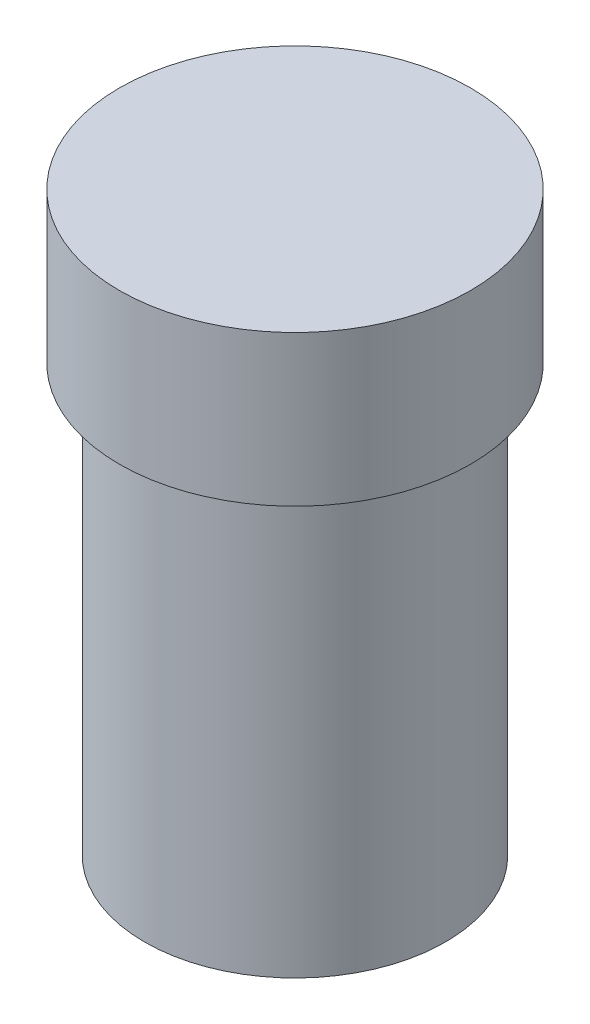
ISO-10303-21;
HEADER;
FILE_DESCRIPTION(('STEP AP214'),'2;1');
FILE_NAME('part.step','',(''),(''),'','','');
FILE_SCHEMA(('AUTOMOTIVE_DESIGN { 1 0 10303 214 1 1 1 1 }'));
ENDSEC;
DATA;
#1=APPLICATION_CONTEXT('core data for automotive mechanical design processes');
#2=APPLICATION_PROTOCOL_DEFINITION('international standard','automotive_design',2000,#1);
#3=PRODUCT_CONTEXT('',#1,'mechanical');
#4=PRODUCT('Part','Part','',(#3));
#5=PRODUCT_RELATED_PRODUCT_CATEGORY('part','',(#4));
#6=PRODUCT_DEFINITION_FORMATION('','',#4);
#7=PRODUCT_DEFINITION_CONTEXT('part definition',#1,'design');
#8=PRODUCT_DEFINITION('design','',#6,#7);
#9=PRODUCT_DEFINITION_SHAPE('','',#8);
#10=(LENGTH_UNIT() NAMED_UNIT(*) SI_UNIT(.MILLI.,.METRE.));
#11=(NAMED_UNIT(*) PLANE_ANGLE_UNIT() SI_UNIT($,.RADIAN.));
#12=(NAMED_UNIT(*) SI_UNIT($,.STERADIAN.) SOLID_ANGLE_UNIT());
#13=UNCERTAINTY_MEASURE_WITH_UNIT(LENGTH_MEASURE(1.E-05),#10,'distance_accuracy_value','');
#14=(GEOMETRIC_REPRESENTATION_CONTEXT(3) GLOBAL_UNCERTAINTY_ASSIGNED_CONTEXT((#13)) GLOBAL_UNIT_ASSIGNED_CONTEXT((#10,
#11,#12)) REPRESENTATION_CONTEXT('',''));
#15=CARTESIAN_POINT('',(0.,0.,0.));
#16=DIRECTION('',(0.,0.,1.));
#17=DIRECTION('',(1.,0.,0.));
#18=AXIS2_PLACEMENT_3D('',#15,#16,#17);
#19=CARTESIAN_POINT('',(0.,23.,0.));
#20=DIRECTION('',(0.,-1.,0.));
#21=DIRECTION('',(0.,0.,-1.));
#22=AXIS2_PLACEMENT_3D('',#19,#20,#21);
#23=CYLINDRICAL_SURFACE('',#22,7.);
#24=CARTESIAN_POINT('',(0.,23.,0.));
#25=DIRECTION('',(0.,1.,0.));
#26=DIRECTION('',(0.,0.,1.));
#27=AXIS2_PLACEMENT_3D('',#24,#25,#26);
#28=CIRCLE('',#27,7.);
#29=CARTESIAN_POINT('',(0.,23.,7.));
#30=VERTEX_POINT('',#29);
#31=EDGE_CURVE('E10',#30,#30,#28,.T.);
#32=ORIENTED_EDGE('',*,*,#31,.F.);
#33=EDGE_LOOP('',(#32));
#34=FACE_BOUND('',#33,.T.);
#35=CARTESIAN_POINT('',(0.,17.,0.));
#36=DIRECTION('',(0.,-1.,0.));
#37=DIRECTION('',(0.,0.,-1.));
#38=AXIS2_PLACEMENT_3D('',#35,#36,#37);
#39=CIRCLE('',#38,7.);
#40=CARTESIAN_POINT('',(0.,17.,-7.));
#41=VERTEX_POINT('',#40);
#42=EDGE_CURVE('E44',#41,#41,#39,.T.);
#43=ORIENTED_EDGE('',*,*,#42,.F.);
#44=EDGE_LOOP('',(#43));
#45=FACE_BOUND('',#44,.T.);
#46=ADVANCED_FACE('F37',(#34,#45),#23,.T.);
#47=CARTESIAN_POINT('',(0.,23.,0.));
#48=DIRECTION('',(0.,1.,0.));
#49=DIRECTION('',(0.,0.,1.));
#50=AXIS2_PLACEMENT_3D('',#47,#48,#49);
#51=PLANE('',#50);
#52=ORIENTED_EDGE('',*,*,#31,.T.);
#53=EDGE_LOOP('',(#52));
#54=FACE_BOUND('',#53,.T.);
#55=ADVANCED_FACE('F72',(#54),#51,.T.);
#56=CARTESIAN_POINT('',(0.,17.,0.));
#57=DIRECTION('',(0.,-1.,0.));
#58=DIRECTION('',(0.,0.,-1.));
#59=AXIS2_PLACEMENT_3D('',#56,#57,#58);
#60=PLANE('',#59);
#61=CARTESIAN_POINT('',(0.,17.,0.));
#62=DIRECTION('',(0.,-1.,0.));
#63=DIRECTION('',(0.,0.,-1.));
#64=AXIS2_PLACEMENT_3D('',#61,#62,#63);
#65=CIRCLE('',#64,6.);
#66=CARTESIAN_POINT('',(0.,17.,-6.));
#67=VERTEX_POINT('',#66);
#68=EDGE_CURVE('E49',#67,#67,#65,.T.);
#69=ORIENTED_EDGE('',*,*,#68,.F.);
#70=EDGE_LOOP('',(#69));
#71=FACE_BOUND('',#70,.T.);
#72=ORIENTED_EDGE('',*,*,#42,.T.);
#73=EDGE_LOOP('',(#72));
#74=FACE_BOUND('',#73,.T.);
#75=ADVANCED_FACE('F65',(#71,#74),#60,.T.);
#76=CARTESIAN_POINT('',(0.,17.,0.));
#77=DIRECTION('',(0.,-1.,0.));
#78=DIRECTION('',(0.,0.,-1.));
#79=AXIS2_PLACEMENT_3D('',#76,#77,#78);
#80=CYLINDRICAL_SURFACE('',#79,6.);
#81=ORIENTED_EDGE('',*,*,#68,.T.);
#82=EDGE_LOOP('',(#81));
#83=FACE_BOUND('',#82,.T.);
#84=CARTESIAN_POINT('',(0.,0.,0.));
#85=DIRECTION('',(0.,-1.,0.));
#86=DIRECTION('',(0.,0.,-1.));
#87=AXIS2_PLACEMENT_3D('',#84,#85,#86);
#88=CIRCLE('',#87,6.);
#89=CARTESIAN_POINT('',(0.,0.,-6.));
#90=VERTEX_POINT('',#89);
#91=EDGE_CURVE('E54',#90,#90,#88,.T.);
#92=ORIENTED_EDGE('',*,*,#91,.F.);
#93=EDGE_LOOP('',(#92));
#94=FACE_BOUND('',#93,.T.);
#95=ADVANCED_FACE('F63',(#83,#94),#80,.T.);
#96=CARTESIAN_POINT('',(0.,0.,0.));
#97=DIRECTION('',(0.,1.,0.));
#98=DIRECTION('',(0.,0.,1.));
#99=AXIS2_PLACEMENT_3D('',#96,#97,#98);
#100=PLANE('',#99);
#101=ORIENTED_EDGE('',*,*,#91,.T.);
#102=EDGE_LOOP('',(#101));
#103=FACE_BOUND('',#102,.T.);
#104=ADVANCED_FACE('F61',(#103),#100,.F.);
#105=CLOSED_SHELL('',(#46,#55,#75,#95,#104));
#106=MANIFOLD_SOLID_BREP('B2',#105);
#107=ADVANCED_BREP_SHAPE_REPRESENTATION('',(#18,#106),#14);
#108=SHAPE_DEFINITION_REPRESENTATION(#9,#107);
ENDSEC;
END-ISO-10303-21;
